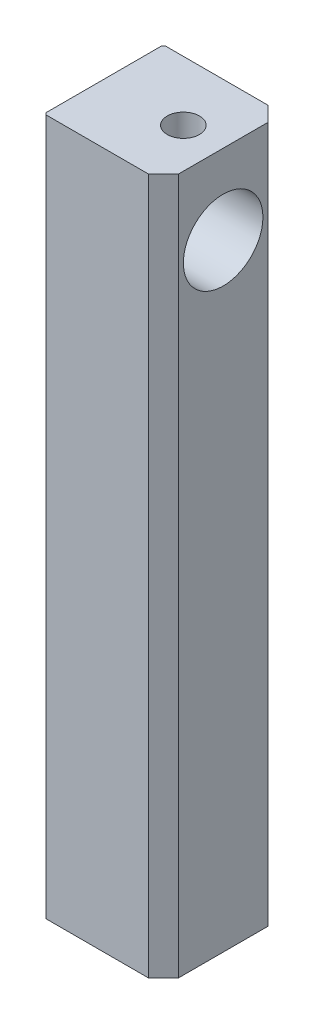
ISO-10303-21;
HEADER;
FILE_DESCRIPTION(('STEP AP214'),'2;1');
FILE_NAME('part.step','',(''),(''),'','','');
FILE_SCHEMA(('AUTOMOTIVE_DESIGN { 1 0 10303 214 1 1 1 1 }'));
ENDSEC;
DATA;
#1=APPLICATION_CONTEXT('core data for automotive mechanical design processes');
#2=APPLICATION_PROTOCOL_DEFINITION('international standard','automotive_design',2000,#1);
#3=PRODUCT_CONTEXT('',#1,'mechanical');
#4=PRODUCT('Part','Part','',(#3));
#5=PRODUCT_RELATED_PRODUCT_CATEGORY('part','',(#4));
#6=PRODUCT_DEFINITION_FORMATION('','',#4);
#7=PRODUCT_DEFINITION_CONTEXT('part definition',#1,'design');
#8=PRODUCT_DEFINITION('design','',#6,#7);
#9=PRODUCT_DEFINITION_SHAPE('','',#8);
#10=(LENGTH_UNIT() NAMED_UNIT(*) SI_UNIT(.MILLI.,.METRE.));
#11=(NAMED_UNIT(*) PLANE_ANGLE_UNIT() SI_UNIT($,.RADIAN.));
#12=(NAMED_UNIT(*) SI_UNIT($,.STERADIAN.) SOLID_ANGLE_UNIT());
#13=UNCERTAINTY_MEASURE_WITH_UNIT(LENGTH_MEASURE(1.E-05),#10,'distance_accuracy_value','');
#14=(GEOMETRIC_REPRESENTATION_CONTEXT(3) GLOBAL_UNCERTAINTY_ASSIGNED_CONTEXT((#13)) GLOBAL_UNIT_ASSIGNED_CONTEXT((#10,
#11,#12)) REPRESENTATION_CONTEXT('',''));
#15=CARTESIAN_POINT('',(0.,0.,0.));
#16=DIRECTION('',(0.,0.,1.));
#17=DIRECTION('',(1.,0.,0.));
#18=AXIS2_PLACEMENT_3D('',#15,#16,#17);
#19=CARTESIAN_POINT('',(12.,70.,6.));
#20=DIRECTION('',(-1.,0.,0.));
#21=DIRECTION('',(0.,0.,1.));
#22=AXIS2_PLACEMENT_3D('',#19,#20,#21);
#23=PLANE('',#22);
#24=DIRECTION('',(0.,0.,-1.));
#25=VECTOR('',#24,1.);
#26=CARTESIAN_POINT('',(12.,0.,6.));
#27=LINE('',#26,#25);
#28=CARTESIAN_POINT('',(12.,0.,4.49999999999999));
#29=VERTEX_POINT('',#28);
#30=CARTESIAN_POINT('',(12.,0.,-4.5));
#31=VERTEX_POINT('',#30);
#32=EDGE_CURVE('E134',#29,#31,#27,.T.);
#33=ORIENTED_EDGE('',*,*,#32,.T.);
#34=DIRECTION('',(0.,1.,0.));
#35=VECTOR('',#34,1.);
#36=CARTESIAN_POINT('',(12.,70.,-4.5));
#37=LINE('',#36,#35);
#38=CARTESIAN_POINT('',(12.,70.,-4.49999999999999));
#39=VERTEX_POINT('',#38);
#40=EDGE_CURVE('E57',#31,#39,#37,.T.);
#41=ORIENTED_EDGE('',*,*,#40,.T.);
#42=DIRECTION('',(0.,0.,-1.));
#43=VECTOR('',#42,1.);
#44=CARTESIAN_POINT('',(12.,70.,6.));
#45=LINE('',#44,#43);
#46=CARTESIAN_POINT('',(12.,70.,4.49999999999999));
#47=VERTEX_POINT('',#46);
#48=EDGE_CURVE('E132',#47,#39,#45,.T.);
#49=ORIENTED_EDGE('',*,*,#48,.F.);
#50=DIRECTION('',(0.,-1.,0.));
#51=VECTOR('',#50,1.);
#52=CARTESIAN_POINT('',(12.,70.,4.49999999999999));
#53=LINE('',#52,#51);
#54=EDGE_CURVE('E155',#47,#29,#53,.T.);
#55=ORIENTED_EDGE('',*,*,#54,.T.);
#56=EDGE_LOOP('',(#33,#41,#49,#55));
#57=FACE_BOUND('',#56,.T.);
#58=CARTESIAN_POINT('',(12.,62.,0.));
#59=DIRECTION('',(1.,0.,0.));
#60=DIRECTION('',(0.,0.,-1.));
#61=AXIS2_PLACEMENT_3D('',#58,#59,#60);
#62=CIRCLE('',#61,4.);
#63=CARTESIAN_POINT('',(12.,62.,-4.));
#64=VERTEX_POINT('',#63);
#65=EDGE_CURVE('E175',#64,#64,#62,.T.);
#66=ORIENTED_EDGE('',*,*,#65,.F.);
#67=EDGE_LOOP('',(#66));
#68=FACE_BOUND('',#67,.T.);
#69=ADVANCED_FACE('F36',(#57,#68),#23,.F.);
#70=CARTESIAN_POINT('',(0.,70.,-6.));
#71=DIRECTION('',(1.,0.,0.));
#72=DIRECTION('',(0.,0.,-1.));
#73=AXIS2_PLACEMENT_3D('',#70,#71,#72);
#74=PLANE('',#73);
#75=DIRECTION('',(0.,0.,1.));
#76=VECTOR('',#75,1.);
#77=CARTESIAN_POINT('',(0.,70.,-6.));
#78=LINE('',#77,#76);
#79=CARTESIAN_POINT('',(0.,70.,-5.79999999999999));
#80=VERTEX_POINT('',#79);
#81=CARTESIAN_POINT('',(0.,70.,5.80000000000001));
#82=VERTEX_POINT('',#81);
#83=EDGE_CURVE('E124',#80,#82,#78,.T.);
#84=ORIENTED_EDGE('',*,*,#83,.F.);
#85=DIRECTION('',(0.,-1.,0.));
#86=VECTOR('',#85,1.);
#87=CARTESIAN_POINT('',(0.,70.,-5.79999999999999));
#88=LINE('',#87,#86);
#89=CARTESIAN_POINT('',(0.,0.,-5.79999999999999));
#90=VERTEX_POINT('',#89);
#91=EDGE_CURVE('E108',#80,#90,#88,.T.);
#92=ORIENTED_EDGE('',*,*,#91,.T.);
#93=DIRECTION('',(0.,0.,1.));
#94=VECTOR('',#93,1.);
#95=CARTESIAN_POINT('',(0.,0.,-6.));
#96=LINE('',#95,#94);
#97=CARTESIAN_POINT('',(0.,0.,5.80000000000001));
#98=VERTEX_POINT('',#97);
#99=EDGE_CURVE('E121',#90,#98,#96,.T.);
#100=ORIENTED_EDGE('',*,*,#99,.T.);
#101=DIRECTION('',(0.,1.,0.));
#102=VECTOR('',#101,1.);
#103=CARTESIAN_POINT('',(0.,70.,5.80000000000001));
#104=LINE('',#103,#102);
#105=EDGE_CURVE('E125',#98,#82,#104,.T.);
#106=ORIENTED_EDGE('',*,*,#105,.T.);
#107=EDGE_LOOP('',(#84,#92,#100,#106));
#108=FACE_BOUND('',#107,.T.);
#109=CARTESIAN_POINT('',(0.,62.,0.));
#110=DIRECTION('',(1.,0.,0.));
#111=DIRECTION('',(0.,0.,-1.));
#112=AXIS2_PLACEMENT_3D('',#109,#110,#111);
#113=CIRCLE('',#112,4.);
#114=CARTESIAN_POINT('',(0.,62.,-4.));
#115=VERTEX_POINT('',#114);
#116=EDGE_CURVE('E180',#115,#115,#113,.T.);
#117=ORIENTED_EDGE('',*,*,#116,.T.);
#118=EDGE_LOOP('',(#117));
#119=FACE_BOUND('',#118,.T.);
#120=ADVANCED_FACE('F119',(#108,#119),#74,.F.);
#121=CARTESIAN_POINT('',(0.,70.,6.));
#122=DIRECTION('',(0.,0.,-1.));
#123=DIRECTION('',(-1.,0.,0.));
#124=AXIS2_PLACEMENT_3D('',#121,#122,#123);
#125=PLANE('',#124);
#126=DIRECTION('',(1.,0.,0.));
#127=VECTOR('',#126,1.);
#128=CARTESIAN_POINT('',(0.,0.,6.));
#129=LINE('',#128,#127);
#130=CARTESIAN_POINT('',(0.200000000000001,0.,6.));
#131=VERTEX_POINT('',#130);
#132=CARTESIAN_POINT('',(10.5,0.,6.));
#133=VERTEX_POINT('',#132);
#134=EDGE_CURVE('E174',#131,#133,#129,.T.);
#135=ORIENTED_EDGE('',*,*,#134,.T.);
#136=DIRECTION('',(0.,1.,0.));
#137=VECTOR('',#136,1.);
#138=CARTESIAN_POINT('',(10.5,70.,6.));
#139=LINE('',#138,#137);
#140=CARTESIAN_POINT('',(10.5,70.,6.));
#141=VERTEX_POINT('',#140);
#142=EDGE_CURVE('E11',#133,#141,#139,.T.);
#143=ORIENTED_EDGE('',*,*,#142,.T.);
#144=DIRECTION('',(1.,0.,0.));
#145=VECTOR('',#144,1.);
#146=CARTESIAN_POINT('',(0.,70.,6.));
#147=LINE('',#146,#145);
#148=CARTESIAN_POINT('',(0.200000000000001,70.,6.));
#149=VERTEX_POINT('',#148);
#150=EDGE_CURVE('E129',#149,#141,#147,.T.);
#151=ORIENTED_EDGE('',*,*,#150,.F.);
#152=DIRECTION('',(0.,-1.,0.));
#153=VECTOR('',#152,1.);
#154=CARTESIAN_POINT('',(0.200000000000001,70.,6.));
#155=LINE('',#154,#153);
#156=EDGE_CURVE('E145',#149,#131,#155,.T.);
#157=ORIENTED_EDGE('',*,*,#156,.T.);
#158=EDGE_LOOP('',(#135,#143,#151,#157));
#159=FACE_BOUND('',#158,.T.);
#160=ADVANCED_FACE('F212',(#159),#125,.F.);
#161=CARTESIAN_POINT('',(12.,70.,-6.));
#162=DIRECTION('',(0.,0.,1.));
#163=DIRECTION('',(1.,0.,0.));
#164=AXIS2_PLACEMENT_3D('',#161,#162,#163);
#165=PLANE('',#164);
#166=DIRECTION('',(-1.,0.,0.));
#167=VECTOR('',#166,1.);
#168=CARTESIAN_POINT('',(12.,70.,-6.));
#169=LINE('',#168,#167);
#170=CARTESIAN_POINT('',(10.5,70.,-6.));
#171=VERTEX_POINT('',#170);
#172=CARTESIAN_POINT('',(0.200000000000016,70.,-6.));
#173=VERTEX_POINT('',#172);
#174=EDGE_CURVE('E164',#171,#173,#169,.T.);
#175=ORIENTED_EDGE('',*,*,#174,.F.);
#176=DIRECTION('',(0.,-1.,0.));
#177=VECTOR('',#176,1.);
#178=CARTESIAN_POINT('',(10.5,70.,-6.));
#179=LINE('',#178,#177);
#180=CARTESIAN_POINT('',(10.5,0.,-6.));
#181=VERTEX_POINT('',#180);
#182=EDGE_CURVE('E148',#171,#181,#179,.T.);
#183=ORIENTED_EDGE('',*,*,#182,.T.);
#184=DIRECTION('',(-1.,0.,0.));
#185=VECTOR('',#184,1.);
#186=CARTESIAN_POINT('',(12.,0.,-6.));
#187=LINE('',#186,#185);
#188=CARTESIAN_POINT('',(0.200000000000009,0.,-6.));
#189=VERTEX_POINT('',#188);
#190=EDGE_CURVE('E130',#181,#189,#187,.T.);
#191=ORIENTED_EDGE('',*,*,#190,.T.);
#192=DIRECTION('',(0.,1.,0.));
#193=VECTOR('',#192,1.);
#194=CARTESIAN_POINT('',(0.200000000000009,70.,-6.));
#195=LINE('',#194,#193);
#196=EDGE_CURVE('E110',#189,#173,#195,.T.);
#197=ORIENTED_EDGE('',*,*,#196,.T.);
#198=EDGE_LOOP('',(#175,#183,#191,#197));
#199=FACE_BOUND('',#198,.T.);
#200=ADVANCED_FACE('F168',(#199),#165,.F.);
#201=CARTESIAN_POINT('',(0.,70.,0.));
#202=DIRECTION('',(0.,1.,0.));
#203=DIRECTION('',(0.,0.,1.));
#204=AXIS2_PLACEMENT_3D('',#201,#202,#203);
#205=PLANE('',#204);
#206=CARTESIAN_POINT('',(8.,70.,0.));
#207=DIRECTION('',(0.,1.,0.));
#208=DIRECTION('',(0.,0.,1.));
#209=AXIS2_PLACEMENT_3D('',#206,#207,#208);
#210=CIRCLE('',#209,1.621);
#211=CARTESIAN_POINT('',(8.,70.,1.621));
#212=VERTEX_POINT('',#211);
#213=EDGE_CURVE('E193',#212,#212,#210,.T.);
#214=ORIENTED_EDGE('',*,*,#213,.F.);
#215=EDGE_LOOP('',(#214));
#216=FACE_BOUND('',#215,.T.);
#217=ORIENTED_EDGE('',*,*,#48,.T.);
#218=DIRECTION('',(0.707106781186548,0.,0.707106781186548));
#219=VECTOR('',#218,1.);
#220=CARTESIAN_POINT('',(8.25,70.,-8.25));
#221=LINE('',#220,#219);
#222=EDGE_CURVE('E44',#39,#171,#221,.F.);
#223=ORIENTED_EDGE('',*,*,#222,.T.);
#224=ORIENTED_EDGE('',*,*,#174,.T.);
#225=DIRECTION('',(0.707106781186549,0.,-0.707106781186546));
#226=VECTOR('',#225,1.);
#227=CARTESIAN_POINT('',(-2.9,70.,-2.90000000000001));
#228=LINE('',#227,#226);
#229=EDGE_CURVE('E143',#173,#80,#228,.F.);
#230=ORIENTED_EDGE('',*,*,#229,.T.);
#231=ORIENTED_EDGE('',*,*,#83,.T.);
#232=DIRECTION('',(-0.707106781186561,0.,-0.707106781186534));
#233=VECTOR('',#232,1.);
#234=CARTESIAN_POINT('',(-2.9,70.,2.90000000000012));
#235=LINE('',#234,#233);
#236=EDGE_CURVE('E141',#82,#149,#235,.F.);
#237=ORIENTED_EDGE('',*,*,#236,.T.);
#238=ORIENTED_EDGE('',*,*,#150,.T.);
#239=DIRECTION('',(-0.707106781186549,0.,0.707106781186546));
#240=VECTOR('',#239,1.);
#241=CARTESIAN_POINT('',(8.24999999999997,70.,8.25000000000001));
#242=LINE('',#241,#240);
#243=EDGE_CURVE('E159',#141,#47,#242,.F.);
#244=ORIENTED_EDGE('',*,*,#243,.T.);
#245=EDGE_LOOP('',(#217,#223,#224,#230,#231,#237,#238,#244));
#246=FACE_BOUND('',#245,.T.);
#247=ADVANCED_FACE('F163',(#216,#246),#205,.T.);
#248=CARTESIAN_POINT('',(0.,0.,0.));
#249=DIRECTION('',(0.,1.,0.));
#250=DIRECTION('',(0.,0.,1.));
#251=AXIS2_PLACEMENT_3D('',#248,#249,#250);
#252=PLANE('',#251);
#253=ORIENTED_EDGE('',*,*,#190,.F.);
#254=DIRECTION('',(-0.707106781186548,0.,-0.707106781186548));
#255=VECTOR('',#254,1.);
#256=CARTESIAN_POINT('',(10.5,0.,-6.));
#257=LINE('',#256,#255);
#258=EDGE_CURVE('E153',#181,#31,#257,.F.);
#259=ORIENTED_EDGE('',*,*,#258,.T.);
#260=ORIENTED_EDGE('',*,*,#32,.F.);
#261=DIRECTION('',(0.707106781186549,0.,-0.707106781186546));
#262=VECTOR('',#261,1.);
#263=CARTESIAN_POINT('',(12.,0.,4.49999999999999));
#264=LINE('',#263,#262);
#265=EDGE_CURVE('E151',#29,#133,#264,.F.);
#266=ORIENTED_EDGE('',*,*,#265,.T.);
#267=ORIENTED_EDGE('',*,*,#134,.F.);
#268=DIRECTION('',(0.707106781186561,0.,0.707106781186534));
#269=VECTOR('',#268,1.);
#270=CARTESIAN_POINT('',(0.200000000000001,0.,6.));
#271=LINE('',#270,#269);
#272=EDGE_CURVE('E114',#131,#98,#271,.F.);
#273=ORIENTED_EDGE('',*,*,#272,.T.);
#274=ORIENTED_EDGE('',*,*,#99,.F.);
#275=DIRECTION('',(-0.707106781186549,0.,0.707106781186546));
#276=VECTOR('',#275,1.);
#277=CARTESIAN_POINT('',(0.,0.,-5.79999999999999));
#278=LINE('',#277,#276);
#279=EDGE_CURVE('E104',#90,#189,#278,.F.);
#280=ORIENTED_EDGE('',*,*,#279,.T.);
#281=EDGE_LOOP('',(#253,#259,#260,#266,#267,#273,#274,#280));
#282=FACE_BOUND('',#281,.T.);
#283=ADVANCED_FACE('F127',(#282),#252,.F.);
#284=CARTESIAN_POINT('',(0.,70.,-5.79999999999999));
#285=DIRECTION('',(0.707106781186546,0.,0.707106781186549));
#286=DIRECTION('',(0.,-1.,0.));
#287=AXIS2_PLACEMENT_3D('',#284,#285,#286);
#288=PLANE('',#287);
#289=ORIENTED_EDGE('',*,*,#229,.F.);
#290=ORIENTED_EDGE('',*,*,#196,.F.);
#291=ORIENTED_EDGE('',*,*,#279,.F.);
#292=ORIENTED_EDGE('',*,*,#91,.F.);
#293=EDGE_LOOP('',(#289,#290,#291,#292));
#294=FACE_BOUND('',#293,.T.);
#295=ADVANCED_FACE('F107',(#294),#288,.F.);
#296=CARTESIAN_POINT('',(0.200000000000001,70.,6.));
#297=DIRECTION('',(0.707106781186534,0.,-0.707106781186561));
#298=DIRECTION('',(0.,-1.,0.));
#299=AXIS2_PLACEMENT_3D('',#296,#297,#298);
#300=PLANE('',#299);
#301=ORIENTED_EDGE('',*,*,#236,.F.);
#302=ORIENTED_EDGE('',*,*,#105,.F.);
#303=ORIENTED_EDGE('',*,*,#272,.F.);
#304=ORIENTED_EDGE('',*,*,#156,.F.);
#305=EDGE_LOOP('',(#301,#302,#303,#304));
#306=FACE_BOUND('',#305,.T.);
#307=ADVANCED_FACE('F220',(#306),#300,.F.);
#308=CARTESIAN_POINT('',(10.5,70.,-6.));
#309=DIRECTION('',(-0.707106781186547,0.,0.707106781186547));
#310=DIRECTION('',(0.,-1.,0.));
#311=AXIS2_PLACEMENT_3D('',#308,#309,#310);
#312=PLANE('',#311);
#313=ORIENTED_EDGE('',*,*,#222,.F.);
#314=ORIENTED_EDGE('',*,*,#40,.F.);
#315=ORIENTED_EDGE('',*,*,#258,.F.);
#316=ORIENTED_EDGE('',*,*,#182,.F.);
#317=EDGE_LOOP('',(#313,#314,#315,#316));
#318=FACE_BOUND('',#317,.T.);
#319=ADVANCED_FACE('F170',(#318),#312,.F.);
#320=CARTESIAN_POINT('',(12.,70.,4.49999999999999));
#321=DIRECTION('',(-0.707106781186546,0.,-0.707106781186549));
#322=DIRECTION('',(0.,-1.,0.));
#323=AXIS2_PLACEMENT_3D('',#320,#321,#322);
#324=PLANE('',#323);
#325=ORIENTED_EDGE('',*,*,#243,.F.);
#326=ORIENTED_EDGE('',*,*,#142,.F.);
#327=ORIENTED_EDGE('',*,*,#265,.F.);
#328=ORIENTED_EDGE('',*,*,#54,.F.);
#329=EDGE_LOOP('',(#325,#326,#327,#328));
#330=FACE_BOUND('',#329,.T.);
#331=ADVANCED_FACE('F38',(#330),#324,.F.);
#332=CARTESIAN_POINT('',(12.,62.,0.));
#333=DIRECTION('',(-1.,0.,0.));
#334=DIRECTION('',(0.,0.,1.));
#335=AXIS2_PLACEMENT_3D('',#332,#333,#334);
#336=CYLINDRICAL_SURFACE('',#335,4.);
#337=CARTESIAN_POINT('',(8.,65.6568236216695,1.621));
#338=CARTESIAN_POINT('',(7.91330090659878,65.6568317504379,1.62099140866588));
#339=CARTESIAN_POINT('',(7.82645079972207,65.6599515768567,1.6140004202904));
#340=CARTESIAN_POINT('',(7.65524268954882,65.6720384236995,1.58629996387938));
#341=CARTESIAN_POINT('',(7.57089230192879,65.6810217073758,1.56555233702693));
#342=CARTESIAN_POINT('',(7.40746298313674,65.7036376517476,1.51126520985485));
#343=CARTESIAN_POINT('',(7.32836476718306,65.7172520339576,1.47777593888313));
#344=CARTESIAN_POINT('',(7.17693402877168,65.7475699803138,1.39910297881101));
#345=CARTESIAN_POINT('',(7.10459965787457,65.764272696736,1.35392249750209));
#346=CARTESIAN_POINT('',(6.96445069201661,65.7999846824487,1.2503082415937));
#347=CARTESIAN_POINT('',(6.8970824551554,65.8190694387087,1.19129644679823));
#348=CARTESIAN_POINT('',(6.77287079015736,65.8567727870221,1.06290987101659));
#349=CARTESIAN_POINT('',(6.71603129408247,65.8753912026803,0.99353123583721));
#350=CARTESIAN_POINT('',(6.61225819046905,65.9109730936938,0.842916355729687));
#351=CARTESIAN_POINT('',(6.56582104349631,65.9278385600458,0.761312800280344));
#352=CARTESIAN_POINT('',(6.48752477196311,65.9570968797665,0.590646195003098));
#353=CARTESIAN_POINT('',(6.45565950694385,65.969491616594,0.501586305958707));
#354=CARTESIAN_POINT('',(6.40901153974712,65.9878774515545,0.323215671290004));
#355=CARTESIAN_POINT('',(6.393460690075,65.994155396908,0.234135977986676));
#356=CARTESIAN_POINT('',(6.37740683407687,66.0006386936155,0.0544250363799293));
#357=CARTESIAN_POINT('',(6.37689807048564,66.0008463683277,-0.0362056050178642));
#358=CARTESIAN_POINT('',(6.39052749579645,65.9953385119449,-0.210882954052066));
#359=CARTESIAN_POINT('',(6.40382330321211,65.989963632256,-0.295008098422387));
#360=CARTESIAN_POINT('',(6.44324813897137,65.9743564574636,-0.459714042262742));
#361=CARTESIAN_POINT('',(6.46937811017411,65.9641238054866,-0.540294580855108));
#362=CARTESIAN_POINT('',(6.53404777685122,65.9396026765887,-0.69708543510473));
#363=CARTESIAN_POINT('',(6.57276941817398,65.9252551231967,-0.773211084393182));
#364=CARTESIAN_POINT('',(6.6613504528049,65.8939218725047,-0.918081650750115));
#365=CARTESIAN_POINT('',(6.71121370412011,65.8769352620002,-0.98682399896364));
#366=CARTESIAN_POINT('',(6.82456366170661,65.8406950335908,-1.1198802837753));
#367=CARTESIAN_POINT('',(6.88874050166689,65.821365781182,-1.18358657279383));
#368=CARTESIAN_POINT('',(7.02693245556546,65.7834915631068,-1.29958574924477));
#369=CARTESIAN_POINT('',(7.10095095034162,65.7649468698535,-1.35187469817178));
#370=CARTESIAN_POINT('',(7.25951244735695,65.7302190339992,-1.44499688227166));
#371=CARTESIAN_POINT('',(7.34430242839782,65.7141222135744,-1.48544449074748));
#372=CARTESIAN_POINT('',(7.52031625974747,65.6871294855861,-1.55124339158436));
#373=CARTESIAN_POINT('',(7.61153575421387,65.6762300950301,-1.57660479660329));
#374=CARTESIAN_POINT('',(7.79174826235184,65.6617173245113,-1.61001232387336));
#375=CARTESIAN_POINT('',(7.88052590520779,65.657692309511,-1.619038801683));
#376=CARTESIAN_POINT('',(8.05839931654766,65.6562099404836,-1.62238586583582));
#377=CARTESIAN_POINT('',(8.14749497560796,65.6587505109346,-1.61671109955473));
#378=CARTESIAN_POINT('',(8.31793410781618,65.6696896988884,-1.59171004587578));
#379=CARTESIAN_POINT('',(8.399424497965,65.6777331368848,-1.57321060565027));
#380=CARTESIAN_POINT('',(8.558086627906,65.6983270282801,-1.52416512962947));
#381=CARTESIAN_POINT('',(8.63525738954934,65.7108784977565,-1.49361637785471));
#382=CARTESIAN_POINT('',(8.78663276829661,65.7397052325138,-1.41993885048143));
#383=CARTESIAN_POINT('',(8.86058471089226,65.7561124617493,-1.37634419772783));
#384=CARTESIAN_POINT('',(9.00046605738883,65.7906050998516,-1.27828459790991));
#385=CARTESIAN_POINT('',(9.06639211035757,65.808691204158,-1.22381513533127));
#386=CARTESIAN_POINT('',(9.19357351980276,65.846167391712,-1.10065492452074));
#387=CARTESIAN_POINT('',(9.25409028805267,65.8655518335753,-1.03119683405698));
#388=CARTESIAN_POINT('',(9.36272942965298,65.902149334365,-0.882652314891284));
#389=CARTESIAN_POINT('',(9.41085117619632,65.9193622834581,-0.803565399564533));
#390=CARTESIAN_POINT('',(9.49319294657126,65.9497487376038,-0.637646496727557));
#391=CARTESIAN_POINT('',(9.5274048534111,65.9629198829934,-0.550810022951796));
#392=CARTESIAN_POINT('',(9.58050165290198,65.9836843516817,-0.371947345413557));
#393=CARTESIAN_POINT('',(9.59939511978869,65.9912807950986,-0.2799240757669));
#394=CARTESIAN_POINT('',(9.62028180206961,65.9996987797305,-0.0999219979859851));
#395=CARTESIAN_POINT('',(9.62331836365985,66.0009384730351,-0.0120829140548032));
#396=CARTESIAN_POINT('',(9.61517576675527,65.9976414154912,0.162813694820943));
#397=CARTESIAN_POINT('',(9.60399886912442,65.9931055833265,0.249871341846723));
#398=CARTESIAN_POINT('',(9.56849379453181,65.9789797828322,0.417857495442004));
#399=CARTESIAN_POINT('',(9.5446002997066,65.9695571150401,0.49889308118731));
#400=CARTESIAN_POINT('',(9.48480216213789,65.9466740132892,0.655786409302657));
#401=CARTESIAN_POINT('',(9.44889517703283,65.933212791956,0.731643138436025));
#402=CARTESIAN_POINT('',(9.36429008005755,65.9028222069298,0.87974342504475));
#403=CARTESIAN_POINT('',(9.31509315442903,65.8857649987299,0.951675209858094));
#404=CARTESIAN_POINT('',(9.20604788458409,65.8502280300435,1.08656223095264));
#405=CARTESIAN_POINT('',(9.14619586281138,65.8317477796542,1.1495143543901));
#406=CARTESIAN_POINT('',(9.01303310202896,65.7939778072942,1.26881658449049));
#407=CARTESIAN_POINT('',(8.93910789846819,65.7747115104915,1.32449068941561));
#408=CARTESIAN_POINT('',(8.78233858874332,65.738797260048,1.42272353368338));
#409=CARTESIAN_POINT('',(8.69948966585856,65.7221507325203,1.46527514159573));
#410=CARTESIAN_POINT('',(8.52772886227234,65.6937444078128,1.53547463588969));
#411=CARTESIAN_POINT('',(8.43887344771259,65.6819449274606,1.56324412352979));
#412=CARTESIAN_POINT('',(8.25729717076084,65.6647610739477,1.60312774071621));
#413=CARTESIAN_POINT('',(8.16459036729093,65.6593551829025,1.61529439396063));
#414=CARTESIAN_POINT('',(8.04777485130996,65.6570554694596,1.62047443411038));
#415=CARTESIAN_POINT('',(8.02389316026365,65.656821381485,1.6210023676617));
#416=CARTESIAN_POINT('',(8.,65.6568236216695,1.621));
#417=B_SPLINE_CURVE_WITH_KNOTS('',3,(#337,#338,#339,#340,#341,#342,#343,#344,#345,#346,#347,
#348,#349,#350,#351,#352,#353,#354,#355,#356,#357,#358,#359,#360,#361,#362,#363,#364,#365,#366,
#367,#368,#369,#370,#371,#372,#373,#374,#375,#376,#377,#378,#379,#380,#381,#382,#383,#384,#385,
#386,#387,#388,#389,#390,#391,#392,#393,#394,#395,#396,#397,#398,#399,#400,#401,#402,#403,#404,
#405,#406,#407,#408,#409,#410,#411,#412,#413,#414,#415,#416),.UNSPECIFIED.,.T.,.F.,(4,2,2,2,2,2,
2,2,2,2,2,2,2,2,2,2,2,2,2,2,2,2,2,2,2,2,2,2,2,2,2,2,2,2,2,2,2,2,2,4),(0.,0.260031894315006,
0.520788111938066,0.780526867606742,1.0401944325325,1.31370143050384,1.58731036732442,
1.87203893329506,2.15664740641965,2.42715471139203,2.697558480029,2.95237948506776,
3.20721921327847,3.46591835828096,3.72470722228277,4.00087966978377,4.27714723526034,
4.56160606559056,4.84587400057819,5.11243107103802,5.37890388742545,5.62962404125013,
5.88040074106865,6.14149535905235,6.40269861688679,6.68380353051441,6.9649226566194,
7.24620559323017,7.52733097760681,7.78970228073533,8.05203185499067,8.30592156040587,
8.55986079750418,8.82511921645348,9.09046936622555,9.37272255767568,9.65512887060892,
9.93517466351604,10.2142752443643,10.2859367056413),.UNSPECIFIED.);
#418=CARTESIAN_POINT('',(8.,65.6568236216695,1.621));
#419=VERTEX_POINT('',#418);
#420=EDGE_CURVE('E183',#419,#419,#417,.T.);
#421=ORIENTED_EDGE('',*,*,#420,.F.);
#422=EDGE_LOOP('',(#421));
#423=FACE_BOUND('',#422,.T.);
#424=ORIENTED_EDGE('',*,*,#65,.T.);
#425=EDGE_LOOP('',(#424));
#426=FACE_BOUND('',#425,.T.);
#427=ORIENTED_EDGE('',*,*,#116,.F.);
#428=EDGE_LOOP('',(#427));
#429=FACE_BOUND('',#428,.T.);
#430=ADVANCED_FACE('F199',(#423,#426,#429),#336,.F.);
#431=CARTESIAN_POINT('',(8.,70.,0.));
#432=DIRECTION('',(0.,1.,0.));
#433=DIRECTION('',(0.,0.,1.));
#434=AXIS2_PLACEMENT_3D('',#431,#432,#433);
#435=CYLINDRICAL_SURFACE('',#434,1.621);
#436=ORIENTED_EDGE('',*,*,#213,.T.);
#437=EDGE_LOOP('',(#436));
#438=FACE_BOUND('',#437,.T.);
#439=ORIENTED_EDGE('',*,*,#420,.T.);
#440=EDGE_LOOP('',(#439));
#441=FACE_BOUND('',#440,.T.);
#442=ADVANCED_FACE('F196',(#438,#441),#435,.F.);
#443=CLOSED_SHELL('',(#69,#120,#160,#200,#247,#283,#295,#307,#319,#331,#430,#442));
#444=MANIFOLD_SOLID_BREP('B2',#443);
#445=ADVANCED_BREP_SHAPE_REPRESENTATION('',(#18,#444),#14);
#446=SHAPE_DEFINITION_REPRESENTATION(#9,#445);
ENDSEC;
END-ISO-10303-21;
